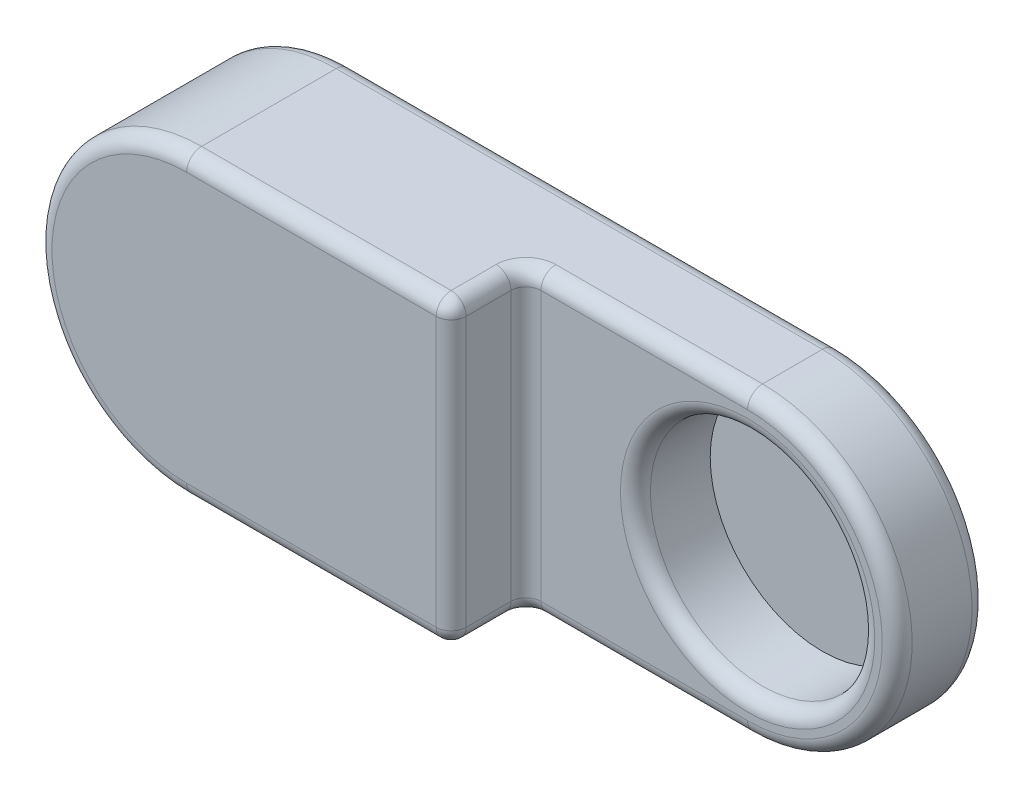
ISO-10303-21;
HEADER;
FILE_DESCRIPTION(('STEP AP214'),'2;1');
FILE_NAME('part.step','',(''),(''),'','','');
FILE_SCHEMA(('AUTOMOTIVE_DESIGN { 1 0 10303 214 1 1 1 1 }'));
ENDSEC;
DATA;
#1=APPLICATION_CONTEXT('core data for automotive mechanical design processes');
#2=APPLICATION_PROTOCOL_DEFINITION('international standard','automotive_design',2000,#1);
#3=PRODUCT_CONTEXT('',#1,'mechanical');
#4=PRODUCT('Part','Part','',(#3));
#5=PRODUCT_RELATED_PRODUCT_CATEGORY('part','',(#4));
#6=PRODUCT_DEFINITION_FORMATION('','',#4);
#7=PRODUCT_DEFINITION_CONTEXT('part definition',#1,'design');
#8=PRODUCT_DEFINITION('design','',#6,#7);
#9=PRODUCT_DEFINITION_SHAPE('','',#8);
#10=(LENGTH_UNIT() NAMED_UNIT(*) SI_UNIT(.MILLI.,.METRE.));
#11=(NAMED_UNIT(*) PLANE_ANGLE_UNIT() SI_UNIT($,.RADIAN.));
#12=(NAMED_UNIT(*) SI_UNIT($,.STERADIAN.) SOLID_ANGLE_UNIT());
#13=UNCERTAINTY_MEASURE_WITH_UNIT(LENGTH_MEASURE(1.E-05),#10,'distance_accuracy_value','');
#14=(GEOMETRIC_REPRESENTATION_CONTEXT(3) GLOBAL_UNCERTAINTY_ASSIGNED_CONTEXT((#13)) GLOBAL_UNIT_ASSIGNED_CONTEXT((#10,
#11,#12)) REPRESENTATION_CONTEXT('',''));
#15=CARTESIAN_POINT('',(0.,0.,0.));
#16=DIRECTION('',(0.,0.,1.));
#17=DIRECTION('',(1.,0.,0.));
#18=AXIS2_PLACEMENT_3D('',#15,#16,#17);
#19=CARTESIAN_POINT('',(324.922829987217,0.0333579448705819,10.));
#20=DIRECTION('',(0.,0.,-1.));
#21=DIRECTION('',(-1.,0.,0.));
#22=AXIS2_PLACEMENT_3D('',#19,#20,#21);
#23=CYLINDRICAL_SURFACE('',#22,74.9159288196887);
#24=CARTESIAN_POINT('',(324.922829987217,0.0333579448705819,10.));
#25=DIRECTION('',(0.,0.,-1.));
#26=DIRECTION('',(-1.,0.,0.));
#27=AXIS2_PLACEMENT_3D('',#24,#25,#26);
#28=CIRCLE('',#27,74.9159288196887);
#29=CARTESIAN_POINT('',(250.006901167528,0.0333579448705819,10.));
#30=VERTEX_POINT('',#29);
#31=EDGE_CURVE('E11',#30,#30,#28,.T.);
#32=ORIENTED_EDGE('',*,*,#31,.T.);
#33=EDGE_LOOP('',(#32));
#34=FACE_BOUND('',#33,.T.);
#35=CARTESIAN_POINT('',(324.922829987217,0.0333579448705819,0.));
#36=DIRECTION('',(0.,0.,-1.));
#37=DIRECTION('',(-1.,0.,0.));
#38=AXIS2_PLACEMENT_3D('',#35,#36,#37);
#39=CIRCLE('',#38,74.9159288196887);
#40=CARTESIAN_POINT('',(250.006901167528,0.0333579448705819,0.));
#41=VERTEX_POINT('',#40);
#42=EDGE_CURVE('E55',#41,#41,#39,.T.);
#43=ORIENTED_EDGE('',*,*,#42,.F.);
#44=EDGE_LOOP('',(#43));
#45=FACE_BOUND('',#44,.T.);
#46=ADVANCED_FACE('F52',(#34,#45),#23,.T.);
#47=CARTESIAN_POINT('',(324.922829987217,0.0333579448705819,10.));
#48=DIRECTION('',(0.,0.,-1.));
#49=DIRECTION('',(-1.,0.,0.));
#50=AXIS2_PLACEMENT_3D('',#47,#48,#49);
#51=PLANE('',#50);
#52=ORIENTED_EDGE('',*,*,#31,.F.);
#53=EDGE_LOOP('',(#52));
#54=FACE_BOUND('',#53,.T.);
#55=ADVANCED_FACE('F67',(#54),#51,.F.);
#56=CARTESIAN_POINT('',(324.922829987217,0.0333579448705819,0.));
#57=DIRECTION('',(0.,0.,-1.));
#58=DIRECTION('',(-1.,0.,0.));
#59=AXIS2_PLACEMENT_3D('',#56,#57,#58);
#60=PLANE('',#59);
#61=ORIENTED_EDGE('',*,*,#42,.T.);
#62=EDGE_LOOP('',(#61));
#63=FACE_BOUND('',#62,.T.);
#64=ADVANCED_FACE('F64',(#63),#60,.T.);
#65=CLOSED_SHELL('',(#46,#55,#64));
#66=MANIFOLD_SOLID_BREP('B2',#65);
#67=CARTESIAN_POINT('',(325.,0.,60.));
#68=DIRECTION('',(0.,0.,1.));
#69=DIRECTION('',(1.,0.,0.));
#70=AXIS2_PLACEMENT_3D('',#67,#68,#69);
#71=PLANE('',#70);
#72=CARTESIAN_POINT('',(325.,0.,60.));
#73=DIRECTION('',(0.,0.,1.));
#74=DIRECTION('',(1.,0.,0.));
#75=AXIS2_PLACEMENT_3D('',#72,#73,#74);
#76=CIRCLE('',#75,85.);
#77=CARTESIAN_POINT('',(410.,0.,60.));
#78=VERTEX_POINT('',#77);
#79=EDGE_CURVE('E102',#78,#78,#76,.F.);
#80=ORIENTED_EDGE('',*,*,#79,.T.);
#81=EDGE_LOOP('',(#80));
#82=FACE_BOUND('',#81,.T.);
#83=CARTESIAN_POINT('',(325.,0.,60.));
#84=DIRECTION('',(0.,0.,1.));
#85=DIRECTION('',(1.,0.,0.));
#86=AXIS2_PLACEMENT_3D('',#83,#84,#85);
#87=CIRCLE('',#86,90.);
#88=CARTESIAN_POINT('',(325.,-90.,60.));
#89=VERTEX_POINT('',#88);
#90=CARTESIAN_POINT('',(325.,90.,60.));
#91=VERTEX_POINT('',#90);
#92=EDGE_CURVE('E110',#89,#91,#87,.T.);
#93=ORIENTED_EDGE('',*,*,#92,.T.);
#94=DIRECTION('',(-1.,0.,0.));
#95=VECTOR('',#94,1.);
#96=CARTESIAN_POINT('',(176.83096553836,90.,60.));
#97=LINE('',#96,#95);
#98=CARTESIAN_POINT('',(186.83096553836,90.,60.));
#99=VERTEX_POINT('',#98);
#100=EDGE_CURVE('E329',#91,#99,#97,.T.);
#101=ORIENTED_EDGE('',*,*,#100,.T.);
#102=DIRECTION('',(0.,1.,0.));
#103=VECTOR('',#102,1.);
#104=CARTESIAN_POINT('',(186.83096553836,0.,60.));
#105=LINE('',#104,#103);
#106=CARTESIAN_POINT('',(186.83096553836,-90.,60.));
#107=VERTEX_POINT('',#106);
#108=EDGE_CURVE('E322',#99,#107,#105,.F.);
#109=ORIENTED_EDGE('',*,*,#108,.T.);
#110=DIRECTION('',(1.,0.,0.));
#111=VECTOR('',#110,1.);
#112=CARTESIAN_POINT('',(325.,-90.,60.));
#113=LINE('',#112,#111);
#114=EDGE_CURVE('E115',#107,#89,#113,.T.);
#115=ORIENTED_EDGE('',*,*,#114,.T.);
#116=EDGE_LOOP('',(#93,#101,#109,#115));
#117=FACE_BOUND('',#116,.T.);
#118=ADVANCED_FACE('F92',(#82,#117),#71,.T.);
#119=CARTESIAN_POINT('',(325.,0.,0.));
#120=DIRECTION('',(0.,0.,1.));
#121=DIRECTION('',(1.,0.,0.));
#122=AXIS2_PLACEMENT_3D('',#119,#120,#121);
#123=PLANE('',#122);
#124=CARTESIAN_POINT('',(0.,0.,0.));
#125=DIRECTION('',(0.,0.,1.));
#126=DIRECTION('',(1.,0.,0.));
#127=AXIS2_PLACEMENT_3D('',#124,#125,#126);
#128=CIRCLE('',#127,85.);
#129=CARTESIAN_POINT('',(85.,0.,0.));
#130=VERTEX_POINT('',#129);
#131=EDGE_CURVE('E216',#130,#130,#128,.T.);
#132=ORIENTED_EDGE('',*,*,#131,.T.);
#133=EDGE_LOOP('',(#132));
#134=FACE_BOUND('',#133,.T.);
#135=DIRECTION('',(-1.,0.,0.));
#136=VECTOR('',#135,1.);
#137=CARTESIAN_POINT('',(325.,90.,0.));
#138=LINE('',#137,#136);
#139=CARTESIAN_POINT('',(0.,90.,0.));
#140=VERTEX_POINT('',#139);
#141=CARTESIAN_POINT('',(325.,90.,0.));
#142=VERTEX_POINT('',#141);
#143=EDGE_CURVE('E289',#140,#142,#138,.F.);
#144=ORIENTED_EDGE('',*,*,#143,.T.);
#145=CARTESIAN_POINT('',(325.,0.,0.));
#146=DIRECTION('',(0.,0.,1.));
#147=DIRECTION('',(1.,0.,0.));
#148=AXIS2_PLACEMENT_3D('',#145,#146,#147);
#149=CIRCLE('',#148,90.);
#150=CARTESIAN_POINT('',(325.,-90.,0.));
#151=VERTEX_POINT('',#150);
#152=EDGE_CURVE('E298',#142,#151,#149,.F.);
#153=ORIENTED_EDGE('',*,*,#152,.T.);
#154=DIRECTION('',(1.,0.,0.));
#155=VECTOR('',#154,1.);
#156=CARTESIAN_POINT('',(325.,-90.,0.));
#157=LINE('',#156,#155);
#158=CARTESIAN_POINT('',(0.,-90.,0.));
#159=VERTEX_POINT('',#158);
#160=EDGE_CURVE('E295',#151,#159,#157,.F.);
#161=ORIENTED_EDGE('',*,*,#160,.T.);
#162=CARTESIAN_POINT('',(0.,0.,0.));
#163=DIRECTION('',(0.,0.,1.));
#164=DIRECTION('',(1.,0.,0.));
#165=AXIS2_PLACEMENT_3D('',#162,#163,#164);
#166=CIRCLE('',#165,90.);
#167=EDGE_CURVE('E292',#159,#140,#166,.F.);
#168=ORIENTED_EDGE('',*,*,#167,.T.);
#169=EDGE_LOOP('',(#144,#153,#161,#168));
#170=FACE_BOUND('',#169,.T.);
#171=CARTESIAN_POINT('',(325.,0.,0.));
#172=DIRECTION('',(0.,0.,1.));
#173=DIRECTION('',(1.,0.,0.));
#174=AXIS2_PLACEMENT_3D('',#171,#172,#173);
#175=CIRCLE('',#174,75.);
#176=CARTESIAN_POINT('',(400.,0.,0.));
#177=VERTEX_POINT('',#176);
#178=EDGE_CURVE('E465',#177,#177,#175,.T.);
#179=ORIENTED_EDGE('',*,*,#178,.T.);
#180=EDGE_LOOP('',(#179));
#181=FACE_BOUND('',#180,.T.);
#182=ADVANCED_FACE('F411',(#134,#170,#181),#123,.F.);
#183=CARTESIAN_POINT('',(325.,0.,60.));
#184=DIRECTION('',(0.,0.,-1.));
#185=DIRECTION('',(-1.,0.,0.));
#186=AXIS2_PLACEMENT_3D('',#183,#184,#185);
#187=CYLINDRICAL_SURFACE('',#186,100.);
#188=DIRECTION('',(0.,0.,-1.));
#189=VECTOR('',#188,1.);
#190=CARTESIAN_POINT('',(325.,-100.,60.));
#191=LINE('',#190,#189);
#192=CARTESIAN_POINT('',(325.,-100.,50.));
#193=VERTEX_POINT('',#192);
#194=CARTESIAN_POINT('',(325.,-100.,10.));
#195=VERTEX_POINT('',#194);
#196=EDGE_CURVE('E428',#193,#195,#191,.T.);
#197=ORIENTED_EDGE('',*,*,#196,.T.);
#198=CARTESIAN_POINT('',(325.,0.,10.));
#199=DIRECTION('',(0.,0.,1.));
#200=DIRECTION('',(1.,0.,0.));
#201=AXIS2_PLACEMENT_3D('',#198,#199,#200);
#202=CIRCLE('',#201,100.);
#203=CARTESIAN_POINT('',(325.,100.,10.));
#204=VERTEX_POINT('',#203);
#205=EDGE_CURVE('E285',#195,#204,#202,.T.);
#206=ORIENTED_EDGE('',*,*,#205,.T.);
#207=DIRECTION('',(0.,0.,-1.));
#208=VECTOR('',#207,1.);
#209=CARTESIAN_POINT('',(325.,100.,60.));
#210=LINE('',#209,#208);
#211=CARTESIAN_POINT('',(325.,100.,50.));
#212=VERTEX_POINT('',#211);
#213=EDGE_CURVE('E228',#212,#204,#210,.T.);
#214=ORIENTED_EDGE('',*,*,#213,.F.);
#215=CARTESIAN_POINT('',(325.,0.,50.));
#216=DIRECTION('',(0.,0.,1.));
#217=DIRECTION('',(1.,0.,0.));
#218=AXIS2_PLACEMENT_3D('',#215,#216,#217);
#219=CIRCLE('',#218,100.);
#220=EDGE_CURVE('E282',#212,#193,#219,.F.);
#221=ORIENTED_EDGE('',*,*,#220,.T.);
#222=EDGE_LOOP('',(#197,#206,#214,#221));
#223=FACE_BOUND('',#222,.T.);
#224=ADVANCED_FACE('F425',(#223),#187,.T.);
#225=CARTESIAN_POINT('',(0.,100.,60.));
#226=DIRECTION('',(0.,-1.,0.));
#227=DIRECTION('',(0.,0.,-1.));
#228=AXIS2_PLACEMENT_3D('',#225,#226,#227);
#229=PLANE('',#228);
#230=DIRECTION('',(0.,0.,-1.));
#231=VECTOR('',#230,1.);
#232=CARTESIAN_POINT('',(0.,100.,60.));
#233=LINE('',#232,#231);
#234=CARTESIAN_POINT('',(0.,100.,100.));
#235=VERTEX_POINT('',#234);
#236=CARTESIAN_POINT('',(0.,100.,10.));
#237=VERTEX_POINT('',#236);
#238=EDGE_CURVE('E206',#235,#237,#233,.T.);
#239=ORIENTED_EDGE('',*,*,#238,.F.);
#240=DIRECTION('',(-1.,0.,0.));
#241=VECTOR('',#240,1.);
#242=CARTESIAN_POINT('',(176.83096553836,100.,100.));
#243=LINE('',#242,#241);
#244=CARTESIAN_POINT('',(166.83096553836,100.,100.));
#245=VERTEX_POINT('',#244);
#246=EDGE_CURVE('E222',#235,#245,#243,.F.);
#247=ORIENTED_EDGE('',*,*,#246,.T.);
#248=DIRECTION('',(0.,0.,-1.));
#249=VECTOR('',#248,1.);
#250=CARTESIAN_POINT('',(166.83096553836,100.,60.));
#251=LINE('',#250,#249);
#252=CARTESIAN_POINT('',(166.83096553836,100.,70.));
#253=VERTEX_POINT('',#252);
#254=EDGE_CURVE('E247',#245,#253,#251,.T.);
#255=ORIENTED_EDGE('',*,*,#254,.T.);
#256=CARTESIAN_POINT('',(186.83096553836,100.,70.));
#257=DIRECTION('',(0.,-1.,0.));
#258=DIRECTION('',(0.,0.,-1.));
#259=AXIS2_PLACEMENT_3D('',#256,#257,#258);
#260=CIRCLE('',#259,20.);
#261=CARTESIAN_POINT('',(186.83096553836,100.,50.));
#262=VERTEX_POINT('',#261);
#263=EDGE_CURVE('E253',#262,#253,#260,.F.);
#264=ORIENTED_EDGE('',*,*,#263,.F.);
#265=DIRECTION('',(-1.,0.,0.));
#266=VECTOR('',#265,1.);
#267=CARTESIAN_POINT('',(325.,100.,50.));
#268=LINE('',#267,#266);
#269=EDGE_CURVE('E420',#262,#212,#268,.F.);
#270=ORIENTED_EDGE('',*,*,#269,.T.);
#271=ORIENTED_EDGE('',*,*,#213,.T.);
#272=DIRECTION('',(-1.,0.,0.));
#273=VECTOR('',#272,1.);
#274=CARTESIAN_POINT('',(0.,100.,10.));
#275=LINE('',#274,#273);
#276=EDGE_CURVE('E226',#204,#237,#275,.T.);
#277=ORIENTED_EDGE('',*,*,#276,.T.);
#278=EDGE_LOOP('',(#239,#247,#255,#264,#270,#271,#277));
#279=FACE_BOUND('',#278,.T.);
#280=ADVANCED_FACE('F219',(#279),#229,.F.);
#281=CARTESIAN_POINT('',(0.,0.,60.));
#282=DIRECTION('',(0.,0.,-1.));
#283=DIRECTION('',(-1.,0.,0.));
#284=AXIS2_PLACEMENT_3D('',#281,#282,#283);
#285=CYLINDRICAL_SURFACE('',#284,100.);
#286=ORIENTED_EDGE('',*,*,#238,.T.);
#287=CARTESIAN_POINT('',(0.,0.,10.));
#288=DIRECTION('',(0.,0.,1.));
#289=DIRECTION('',(1.,0.,0.));
#290=AXIS2_PLACEMENT_3D('',#287,#288,#289);
#291=CIRCLE('',#290,100.);
#292=CARTESIAN_POINT('',(0.,-100.,10.));
#293=VERTEX_POINT('',#292);
#294=EDGE_CURVE('E215',#237,#293,#291,.T.);
#295=ORIENTED_EDGE('',*,*,#294,.T.);
#296=DIRECTION('',(0.,0.,-1.));
#297=VECTOR('',#296,1.);
#298=CARTESIAN_POINT('',(0.,-100.,60.));
#299=LINE('',#298,#297);
#300=CARTESIAN_POINT('',(0.,-100.,100.));
#301=VERTEX_POINT('',#300);
#302=EDGE_CURVE('E209',#301,#293,#299,.T.);
#303=ORIENTED_EDGE('',*,*,#302,.F.);
#304=CARTESIAN_POINT('',(0.,0.,100.));
#305=DIRECTION('',(0.,0.,1.));
#306=DIRECTION('',(1.,0.,0.));
#307=AXIS2_PLACEMENT_3D('',#304,#305,#306);
#308=CIRCLE('',#307,100.);
#309=EDGE_CURVE('E203',#301,#235,#308,.F.);
#310=ORIENTED_EDGE('',*,*,#309,.T.);
#311=EDGE_LOOP('',(#286,#295,#303,#310));
#312=FACE_BOUND('',#311,.T.);
#313=ADVANCED_FACE('F205',(#312),#285,.T.);
#314=CARTESIAN_POINT('',(0.,-100.,60.));
#315=DIRECTION('',(0.,1.,0.));
#316=DIRECTION('',(0.,0.,1.));
#317=AXIS2_PLACEMENT_3D('',#314,#315,#316);
#318=PLANE('',#317);
#319=ORIENTED_EDGE('',*,*,#302,.T.);
#320=DIRECTION('',(1.,0.,0.));
#321=VECTOR('',#320,1.);
#322=CARTESIAN_POINT('',(0.,-100.,10.));
#323=LINE('',#322,#321);
#324=EDGE_CURVE('E279',#293,#195,#323,.T.);
#325=ORIENTED_EDGE('',*,*,#324,.T.);
#326=ORIENTED_EDGE('',*,*,#196,.F.);
#327=DIRECTION('',(1.,0.,0.));
#328=VECTOR('',#327,1.);
#329=CARTESIAN_POINT('',(176.83096553836,-100.,50.));
#330=LINE('',#329,#328);
#331=CARTESIAN_POINT('',(186.83096553836,-100.,50.));
#332=VERTEX_POINT('',#331);
#333=EDGE_CURVE('E270',#193,#332,#330,.F.);
#334=ORIENTED_EDGE('',*,*,#333,.T.);
#335=CARTESIAN_POINT('',(186.83096553836,-100.,70.));
#336=DIRECTION('',(0.,1.,0.));
#337=DIRECTION('',(0.,0.,1.));
#338=AXIS2_PLACEMENT_3D('',#335,#336,#337);
#339=CIRCLE('',#338,20.);
#340=CARTESIAN_POINT('',(166.83096553836,-100.,70.));
#341=VERTEX_POINT('',#340);
#342=EDGE_CURVE('E266',#341,#332,#339,.F.);
#343=ORIENTED_EDGE('',*,*,#342,.F.);
#344=DIRECTION('',(0.,0.,-1.));
#345=VECTOR('',#344,1.);
#346=CARTESIAN_POINT('',(166.83096553836,-100.,60.));
#347=LINE('',#346,#345);
#348=CARTESIAN_POINT('',(166.83096553836,-100.,100.));
#349=VERTEX_POINT('',#348);
#350=EDGE_CURVE('E273',#341,#349,#347,.F.);
#351=ORIENTED_EDGE('',*,*,#350,.T.);
#352=DIRECTION('',(1.,0.,0.));
#353=VECTOR('',#352,1.);
#354=CARTESIAN_POINT('',(0.,-100.,100.));
#355=LINE('',#354,#353);
#356=EDGE_CURVE('E276',#349,#301,#355,.F.);
#357=ORIENTED_EDGE('',*,*,#356,.T.);
#358=EDGE_LOOP('',(#319,#325,#326,#334,#343,#351,#357));
#359=FACE_BOUND('',#358,.T.);
#360=ADVANCED_FACE('F462',(#359),#318,.F.);
#361=CARTESIAN_POINT('',(0.,0.,60.));
#362=DIRECTION('',(0.,0.,-1.));
#363=DIRECTION('',(-1.,0.,0.));
#364=AXIS2_PLACEMENT_3D('',#361,#362,#363);
#365=CYLINDRICAL_SURFACE('',#364,75.);
#366=CARTESIAN_POINT('',(0.,0.,10.));
#367=DIRECTION('',(0.,0.,1.));
#368=DIRECTION('',(1.,0.,0.));
#369=AXIS2_PLACEMENT_3D('',#366,#367,#368);
#370=CIRCLE('',#369,75.);
#371=CARTESIAN_POINT('',(75.,0.,10.));
#372=VERTEX_POINT('',#371);
#373=EDGE_CURVE('E50',#372,#372,#370,.F.);
#374=ORIENTED_EDGE('',*,*,#373,.T.);
#375=EDGE_LOOP('',(#374));
#376=FACE_BOUND('',#375,.T.);
#377=CARTESIAN_POINT('',(0.,0.,60.));
#378=DIRECTION('',(0.,0.,1.));
#379=DIRECTION('',(1.,0.,0.));
#380=AXIS2_PLACEMENT_3D('',#377,#378,#379);
#381=CIRCLE('',#380,75.);
#382=CARTESIAN_POINT('',(75.,0.,60.));
#383=VERTEX_POINT('',#382);
#384=EDGE_CURVE('E387',#383,#383,#381,.T.);
#385=ORIENTED_EDGE('',*,*,#384,.T.);
#386=EDGE_LOOP('',(#385));
#387=FACE_BOUND('',#386,.T.);
#388=ADVANCED_FACE('F497',(#376,#387),#365,.F.);
#389=CARTESIAN_POINT('',(325.,0.,60.));
#390=DIRECTION('',(0.,0.,-1.));
#391=DIRECTION('',(-1.,0.,0.));
#392=AXIS2_PLACEMENT_3D('',#389,#390,#391);
#393=CYLINDRICAL_SURFACE('',#392,75.);
#394=CARTESIAN_POINT('',(325.,0.,50.));
#395=DIRECTION('',(0.,0.,1.));
#396=DIRECTION('',(1.,0.,0.));
#397=AXIS2_PLACEMENT_3D('',#394,#395,#396);
#398=CIRCLE('',#397,75.);
#399=CARTESIAN_POINT('',(400.,0.,50.));
#400=VERTEX_POINT('',#399);
#401=EDGE_CURVE('E318',#400,#400,#398,.T.);
#402=ORIENTED_EDGE('',*,*,#401,.T.);
#403=EDGE_LOOP('',(#402));
#404=FACE_BOUND('',#403,.T.);
#405=ORIENTED_EDGE('',*,*,#178,.F.);
#406=EDGE_LOOP('',(#405));
#407=FACE_BOUND('',#406,.T.);
#408=ADVANCED_FACE('F494',(#404,#407),#393,.F.);
#409=CARTESIAN_POINT('',(0.,0.,110.));
#410=DIRECTION('',(0.,0.,1.));
#411=DIRECTION('',(1.,0.,0.));
#412=AXIS2_PLACEMENT_3D('',#409,#410,#411);
#413=PLANE('',#412);
#414=DIRECTION('',(1.,0.,0.));
#415=VECTOR('',#414,1.);
#416=CARTESIAN_POINT('',(176.83096553836,-90.,110.));
#417=LINE('',#416,#415);
#418=CARTESIAN_POINT('',(0.,-90.,110.));
#419=VERTEX_POINT('',#418);
#420=CARTESIAN_POINT('',(166.83096553836,-90.,110.));
#421=VERTEX_POINT('',#420);
#422=EDGE_CURVE('E309',#419,#421,#417,.T.);
#423=ORIENTED_EDGE('',*,*,#422,.T.);
#424=DIRECTION('',(0.,1.,0.));
#425=VECTOR('',#424,1.);
#426=CARTESIAN_POINT('',(166.83096553836,100.,110.));
#427=LINE('',#426,#425);
#428=CARTESIAN_POINT('',(166.83096553836,90.,110.));
#429=VERTEX_POINT('',#428);
#430=EDGE_CURVE('E315',#421,#429,#427,.T.);
#431=ORIENTED_EDGE('',*,*,#430,.T.);
#432=DIRECTION('',(-1.,0.,0.));
#433=VECTOR('',#432,1.);
#434=CARTESIAN_POINT('',(0.,90.,110.));
#435=LINE('',#434,#433);
#436=CARTESIAN_POINT('',(0.,90.,110.));
#437=VERTEX_POINT('',#436);
#438=EDGE_CURVE('E312',#429,#437,#435,.T.);
#439=ORIENTED_EDGE('',*,*,#438,.T.);
#440=CARTESIAN_POINT('',(0.,0.,110.));
#441=DIRECTION('',(0.,0.,1.));
#442=DIRECTION('',(1.,0.,0.));
#443=AXIS2_PLACEMENT_3D('',#440,#441,#442);
#444=CIRCLE('',#443,90.);
#445=EDGE_CURVE('E233',#437,#419,#444,.T.);
#446=ORIENTED_EDGE('',*,*,#445,.T.);
#447=EDGE_LOOP('',(#423,#431,#439,#446));
#448=FACE_BOUND('',#447,.T.);
#449=ADVANCED_FACE('F496',(#448),#413,.T.);
#450=CARTESIAN_POINT('',(176.83096553836,100.,110.));
#451=DIRECTION('',(-1.,0.,0.));
#452=DIRECTION('',(0.,-1.,0.));
#453=AXIS2_PLACEMENT_3D('',#450,#451,#452);
#454=PLANE('',#453);
#455=DIRECTION('',(0.,0.,-1.));
#456=VECTOR('',#455,1.);
#457=CARTESIAN_POINT('',(176.83096553836,-90.,110.));
#458=LINE('',#457,#456);
#459=CARTESIAN_POINT('',(176.83096553836,-90.,100.));
#460=VERTEX_POINT('',#459);
#461=CARTESIAN_POINT('',(176.83096553836,-90.,70.));
#462=VERTEX_POINT('',#461);
#463=EDGE_CURVE('E251',#460,#462,#458,.T.);
#464=ORIENTED_EDGE('',*,*,#463,.T.);
#465=DIRECTION('',(0.,1.,0.));
#466=VECTOR('',#465,1.);
#467=CARTESIAN_POINT('',(176.83096553836,100.,70.));
#468=LINE('',#467,#466);
#469=CARTESIAN_POINT('',(176.83096553836,90.,70.));
#470=VERTEX_POINT('',#469);
#471=EDGE_CURVE('E263',#462,#470,#468,.T.);
#472=ORIENTED_EDGE('',*,*,#471,.T.);
#473=DIRECTION('',(0.,0.,-1.));
#474=VECTOR('',#473,1.);
#475=CARTESIAN_POINT('',(176.83096553836,90.,110.));
#476=LINE('',#475,#474);
#477=CARTESIAN_POINT('',(176.83096553836,90.,100.));
#478=VERTEX_POINT('',#477);
#479=EDGE_CURVE('E259',#470,#478,#476,.F.);
#480=ORIENTED_EDGE('',*,*,#479,.T.);
#481=DIRECTION('',(0.,1.,0.));
#482=VECTOR('',#481,1.);
#483=CARTESIAN_POINT('',(176.83096553836,-100.,100.));
#484=LINE('',#483,#482);
#485=EDGE_CURVE('E246',#478,#460,#484,.F.);
#486=ORIENTED_EDGE('',*,*,#485,.T.);
#487=EDGE_LOOP('',(#464,#472,#480,#486));
#488=FACE_BOUND('',#487,.T.);
#489=ADVANCED_FACE('F446',(#488),#454,.F.);
#490=CARTESIAN_POINT('',(0.,0.,60.));
#491=DIRECTION('',(0.,0.,1.));
#492=DIRECTION('',(1.,0.,0.));
#493=AXIS2_PLACEMENT_3D('',#490,#491,#492);
#494=PLANE('',#493);
#495=ORIENTED_EDGE('',*,*,#384,.F.);
#496=EDGE_LOOP('',(#495));
#497=FACE_BOUND('',#496,.T.);
#498=ADVANCED_FACE('F559',(#497),#494,.F.);
#499=CARTESIAN_POINT('',(0.,-90.,100.));
#500=DIRECTION('',(-1.,0.,0.));
#501=DIRECTION('',(0.,0.,1.));
#502=AXIS2_PLACEMENT_3D('',#499,#500,#501);
#503=CYLINDRICAL_SURFACE('',#502,10.);
#504=CARTESIAN_POINT('',(0.,-90.,100.));
#505=DIRECTION('',(-1.,0.,0.));
#506=DIRECTION('',(0.,0.,1.));
#507=AXIS2_PLACEMENT_3D('',#504,#505,#506);
#508=CIRCLE('',#507,10.);
#509=EDGE_CURVE('E376',#301,#419,#508,.T.);
#510=ORIENTED_EDGE('',*,*,#509,.F.);
#511=ORIENTED_EDGE('',*,*,#356,.F.);
#512=CARTESIAN_POINT('',(166.83096553836,-90.,100.));
#513=DIRECTION('',(1.,0.,0.));
#514=DIRECTION('',(0.,0.,-1.));
#515=AXIS2_PLACEMENT_3D('',#512,#513,#514);
#516=CIRCLE('',#515,10.);
#517=EDGE_CURVE('E379',#421,#349,#516,.T.);
#518=ORIENTED_EDGE('',*,*,#517,.F.);
#519=ORIENTED_EDGE('',*,*,#422,.F.);
#520=EDGE_LOOP('',(#510,#511,#518,#519));
#521=FACE_BOUND('',#520,.T.);
#522=ADVANCED_FACE('F484',(#521),#503,.T.);
#523=CARTESIAN_POINT('',(325.,-90.,50.));
#524=DIRECTION('',(-1.,0.,0.));
#525=DIRECTION('',(0.,0.,1.));
#526=AXIS2_PLACEMENT_3D('',#523,#524,#525);
#527=CYLINDRICAL_SURFACE('',#526,10.);
#528=CARTESIAN_POINT('',(186.83096553836,-90.,50.));
#529=DIRECTION('',(-1.,0.,0.));
#530=DIRECTION('',(0.,0.,1.));
#531=AXIS2_PLACEMENT_3D('',#528,#529,#530);
#532=CIRCLE('',#531,10.);
#533=EDGE_CURVE('E368',#332,#107,#532,.T.);
#534=ORIENTED_EDGE('',*,*,#533,.F.);
#535=ORIENTED_EDGE('',*,*,#333,.F.);
#536=CARTESIAN_POINT('',(325.,-90.,50.));
#537=DIRECTION('',(1.,0.,0.));
#538=DIRECTION('',(0.,0.,-1.));
#539=AXIS2_PLACEMENT_3D('',#536,#537,#538);
#540=CIRCLE('',#539,10.);
#541=EDGE_CURVE('E372',#89,#193,#540,.T.);
#542=ORIENTED_EDGE('',*,*,#541,.F.);
#543=ORIENTED_EDGE('',*,*,#114,.F.);
#544=EDGE_LOOP('',(#534,#535,#542,#543));
#545=FACE_BOUND('',#544,.T.);
#546=ADVANCED_FACE('F468',(#545),#527,.T.);
#547=CARTESIAN_POINT('',(166.83096553836,-90.,110.));
#548=DIRECTION('',(0.,0.,-1.));
#549=DIRECTION('',(-1.,0.,0.));
#550=AXIS2_PLACEMENT_3D('',#547,#548,#549);
#551=CYLINDRICAL_SURFACE('',#550,10.);
#552=CARTESIAN_POINT('',(166.83096553836,-90.,100.));
#553=DIRECTION('',(0.,0.,1.));
#554=DIRECTION('',(1.,0.,0.));
#555=AXIS2_PLACEMENT_3D('',#552,#553,#554);
#556=CIRCLE('',#555,10.);
#557=EDGE_CURVE('E383',#349,#460,#556,.T.);
#558=ORIENTED_EDGE('',*,*,#557,.F.);
#559=ORIENTED_EDGE('',*,*,#350,.F.);
#560=CARTESIAN_POINT('',(166.83096553836,-90.,70.));
#561=DIRECTION('',(0.,0.,-1.));
#562=DIRECTION('',(-1.,0.,0.));
#563=AXIS2_PLACEMENT_3D('',#560,#561,#562);
#564=CIRCLE('',#563,10.);
#565=EDGE_CURVE('E364',#462,#341,#564,.T.);
#566=ORIENTED_EDGE('',*,*,#565,.F.);
#567=ORIENTED_EDGE('',*,*,#463,.F.);
#568=EDGE_LOOP('',(#558,#559,#566,#567));
#569=FACE_BOUND('',#568,.T.);
#570=ADVANCED_FACE('F476',(#569),#551,.T.);
#571=CARTESIAN_POINT('',(166.83096553836,-90.,100.));
#572=DIRECTION('',(0.,-1.,0.));
#573=DIRECTION('',(0.,0.,-1.));
#574=AXIS2_PLACEMENT_3D('',#571,#572,#573);
#575=SPHERICAL_SURFACE('',#574,10.);
#576=ORIENTED_EDGE('',*,*,#517,.T.);
#577=ORIENTED_EDGE('',*,*,#557,.T.);
#578=CARTESIAN_POINT('',(166.83096553836,-90.,100.));
#579=DIRECTION('',(0.,-1.,0.));
#580=DIRECTION('',(0.,0.,-1.));
#581=AXIS2_PLACEMENT_3D('',#578,#579,#580);
#582=CIRCLE('',#581,10.);
#583=EDGE_CURVE('E238',#421,#460,#582,.F.);
#584=ORIENTED_EDGE('',*,*,#583,.F.);
#585=EDGE_LOOP('',(#576,#577,#584));
#586=FACE_BOUND('',#585,.T.);
#587=ADVANCED_FACE('F480',(#586),#575,.T.);
#588=CARTESIAN_POINT('',(0.,0.,100.));
#589=DIRECTION('',(0.,0.,1.));
#590=DIRECTION('',(1.,0.,0.));
#591=AXIS2_PLACEMENT_3D('',#588,#589,#590);
#592=TOROIDAL_SURFACE('',#591,90.,10.);
#593=ORIENTED_EDGE('',*,*,#509,.T.);
#594=ORIENTED_EDGE('',*,*,#445,.F.);
#595=CARTESIAN_POINT('',(0.,90.,100.));
#596=DIRECTION('',(1.,0.,0.));
#597=DIRECTION('',(0.,0.,-1.));
#598=AXIS2_PLACEMENT_3D('',#595,#596,#597);
#599=CIRCLE('',#598,10.);
#600=EDGE_CURVE('E231',#235,#437,#599,.T.);
#601=ORIENTED_EDGE('',*,*,#600,.F.);
#602=ORIENTED_EDGE('',*,*,#309,.F.);
#603=EDGE_LOOP('',(#593,#594,#601,#602));
#604=FACE_BOUND('',#603,.T.);
#605=ADVANCED_FACE('F232',(#604),#592,.T.);
#606=CARTESIAN_POINT('',(325.,0.,50.));
#607=DIRECTION('',(0.,0.,1.));
#608=DIRECTION('',(1.,0.,0.));
#609=AXIS2_PLACEMENT_3D('',#606,#607,#608);
#610=TOROIDAL_SURFACE('',#609,90.,10.);
#611=ORIENTED_EDGE('',*,*,#541,.T.);
#612=ORIENTED_EDGE('',*,*,#220,.F.);
#613=CARTESIAN_POINT('',(325.,90.,50.));
#614=DIRECTION('',(-1.,0.,0.));
#615=DIRECTION('',(0.,0.,1.));
#616=AXIS2_PLACEMENT_3D('',#613,#614,#615);
#617=CIRCLE('',#616,10.);
#618=EDGE_CURVE('E239',#91,#212,#617,.T.);
#619=ORIENTED_EDGE('',*,*,#618,.F.);
#620=ORIENTED_EDGE('',*,*,#92,.F.);
#621=EDGE_LOOP('',(#611,#612,#619,#620));
#622=FACE_BOUND('',#621,.T.);
#623=ADVANCED_FACE('F459',(#622),#610,.T.);
#624=CARTESIAN_POINT('',(186.83096553836,-90.,70.));
#625=DIRECTION('',(0.,1.,0.));
#626=DIRECTION('',(0.,0.,1.));
#627=AXIS2_PLACEMENT_3D('',#624,#625,#626);
#628=TOROIDAL_SURFACE('',#627,20.,10.);
#629=ORIENTED_EDGE('',*,*,#342,.T.);
#630=ORIENTED_EDGE('',*,*,#533,.T.);
#631=CARTESIAN_POINT('',(186.83096553836,-90.,70.));
#632=DIRECTION('',(0.,1.,0.));
#633=DIRECTION('',(0.,0.,1.));
#634=AXIS2_PLACEMENT_3D('',#631,#632,#633);
#635=CIRCLE('',#634,10.);
#636=EDGE_CURVE('E354',#462,#107,#635,.F.);
#637=ORIENTED_EDGE('',*,*,#636,.F.);
#638=ORIENTED_EDGE('',*,*,#565,.T.);
#639=EDGE_LOOP('',(#629,#630,#637,#638));
#640=FACE_BOUND('',#639,.T.);
#641=ADVANCED_FACE('F471',(#640),#628,.T.);
#642=CARTESIAN_POINT('',(166.83096553836,0.,100.));
#643=DIRECTION('',(0.,-1.,0.));
#644=DIRECTION('',(1.,0.,0.));
#645=AXIS2_PLACEMENT_3D('',#642,#643,#644);
#646=CYLINDRICAL_SURFACE('',#645,10.);
#647=ORIENTED_EDGE('',*,*,#583,.T.);
#648=ORIENTED_EDGE('',*,*,#485,.F.);
#649=CARTESIAN_POINT('',(166.83096553836,90.,100.));
#650=DIRECTION('',(0.,1.,0.));
#651=DIRECTION('',(0.,0.,1.));
#652=AXIS2_PLACEMENT_3D('',#649,#650,#651);
#653=CIRCLE('',#652,10.);
#654=EDGE_CURVE('E350',#429,#478,#653,.T.);
#655=ORIENTED_EDGE('',*,*,#654,.F.);
#656=ORIENTED_EDGE('',*,*,#430,.F.);
#657=EDGE_LOOP('',(#647,#648,#655,#656));
#658=FACE_BOUND('',#657,.T.);
#659=ADVANCED_FACE('F541',(#658),#646,.T.);
#660=CARTESIAN_POINT('',(0.,90.,100.));
#661=DIRECTION('',(1.,0.,0.));
#662=DIRECTION('',(0.,0.,-1.));
#663=AXIS2_PLACEMENT_3D('',#660,#661,#662);
#664=CYLINDRICAL_SURFACE('',#663,10.);
#665=ORIENTED_EDGE('',*,*,#600,.T.);
#666=ORIENTED_EDGE('',*,*,#438,.F.);
#667=CARTESIAN_POINT('',(166.83096553836,90.,100.));
#668=DIRECTION('',(1.,0.,0.));
#669=DIRECTION('',(0.,0.,-1.));
#670=AXIS2_PLACEMENT_3D('',#667,#668,#669);
#671=CIRCLE('',#670,10.);
#672=EDGE_CURVE('E243',#245,#429,#671,.T.);
#673=ORIENTED_EDGE('',*,*,#672,.F.);
#674=ORIENTED_EDGE('',*,*,#246,.F.);
#675=EDGE_LOOP('',(#665,#666,#673,#674));
#676=FACE_BOUND('',#675,.T.);
#677=ADVANCED_FACE('F241',(#676),#664,.T.);
#678=CARTESIAN_POINT('',(325.,90.,50.));
#679=DIRECTION('',(1.,0.,0.));
#680=DIRECTION('',(0.,0.,-1.));
#681=AXIS2_PLACEMENT_3D('',#678,#679,#680);
#682=CYLINDRICAL_SURFACE('',#681,10.);
#683=ORIENTED_EDGE('',*,*,#618,.T.);
#684=ORIENTED_EDGE('',*,*,#269,.F.);
#685=CARTESIAN_POINT('',(186.83096553836,90.,50.));
#686=DIRECTION('',(-1.,0.,0.));
#687=DIRECTION('',(0.,0.,1.));
#688=AXIS2_PLACEMENT_3D('',#685,#686,#687);
#689=CIRCLE('',#688,10.);
#690=EDGE_CURVE('E344',#99,#262,#689,.T.);
#691=ORIENTED_EDGE('',*,*,#690,.F.);
#692=ORIENTED_EDGE('',*,*,#100,.F.);
#693=EDGE_LOOP('',(#683,#684,#691,#692));
#694=FACE_BOUND('',#693,.T.);
#695=ADVANCED_FACE('F457',(#694),#682,.T.);
#696=CARTESIAN_POINT('',(186.83096553836,100.,70.));
#697=DIRECTION('',(0.,1.,0.));
#698=DIRECTION('',(-1.,0.,0.));
#699=AXIS2_PLACEMENT_3D('',#696,#697,#698);
#700=CYLINDRICAL_SURFACE('',#699,10.);
#701=ORIENTED_EDGE('',*,*,#636,.T.);
#702=ORIENTED_EDGE('',*,*,#108,.F.);
#703=CARTESIAN_POINT('',(186.83096553836,90.,70.));
#704=DIRECTION('',(0.,-1.,0.));
#705=DIRECTION('',(0.,0.,-1.));
#706=AXIS2_PLACEMENT_3D('',#703,#704,#705);
#707=CIRCLE('',#706,10.);
#708=EDGE_CURVE('E341',#470,#99,#707,.T.);
#709=ORIENTED_EDGE('',*,*,#708,.F.);
#710=ORIENTED_EDGE('',*,*,#471,.F.);
#711=EDGE_LOOP('',(#701,#702,#709,#710));
#712=FACE_BOUND('',#711,.T.);
#713=ADVANCED_FACE('F454',(#712),#700,.F.);
#714=CARTESIAN_POINT('',(166.83096553836,90.,100.));
#715=DIRECTION('',(0.,0.,1.));
#716=DIRECTION('',(1.,0.,0.));
#717=AXIS2_PLACEMENT_3D('',#714,#715,#716);
#718=SPHERICAL_SURFACE('',#717,10.);
#719=ORIENTED_EDGE('',*,*,#672,.T.);
#720=ORIENTED_EDGE('',*,*,#654,.T.);
#721=CARTESIAN_POINT('',(166.83096553836,90.,100.));
#722=DIRECTION('',(0.,0.,1.));
#723=DIRECTION('',(1.,0.,0.));
#724=AXIS2_PLACEMENT_3D('',#721,#722,#723);
#725=CIRCLE('',#724,10.);
#726=EDGE_CURVE('E338',#245,#478,#725,.F.);
#727=ORIENTED_EDGE('',*,*,#726,.F.);
#728=EDGE_LOOP('',(#719,#720,#727));
#729=FACE_BOUND('',#728,.T.);
#730=ADVANCED_FACE('F531',(#729),#718,.T.);
#731=CARTESIAN_POINT('',(186.83096553836,90.,70.));
#732=DIRECTION('',(0.,-1.,0.));
#733=DIRECTION('',(0.,0.,-1.));
#734=AXIS2_PLACEMENT_3D('',#731,#732,#733);
#735=TOROIDAL_SURFACE('',#734,20.,10.);
#736=ORIENTED_EDGE('',*,*,#690,.T.);
#737=ORIENTED_EDGE('',*,*,#263,.T.);
#738=CARTESIAN_POINT('',(166.83096553836,90.,70.));
#739=DIRECTION('',(0.,0.,-1.));
#740=DIRECTION('',(-1.,0.,0.));
#741=AXIS2_PLACEMENT_3D('',#738,#739,#740);
#742=CIRCLE('',#741,10.);
#743=EDGE_CURVE('E335',#470,#253,#742,.F.);
#744=ORIENTED_EDGE('',*,*,#743,.F.);
#745=ORIENTED_EDGE('',*,*,#708,.T.);
#746=EDGE_LOOP('',(#736,#737,#744,#745));
#747=FACE_BOUND('',#746,.T.);
#748=ADVANCED_FACE('F439',(#747),#735,.T.);
#749=CARTESIAN_POINT('',(166.83096553836,90.,60.));
#750=DIRECTION('',(0.,0.,-1.));
#751=DIRECTION('',(-1.,0.,0.));
#752=AXIS2_PLACEMENT_3D('',#749,#750,#751);
#753=CYLINDRICAL_SURFACE('',#752,10.);
#754=ORIENTED_EDGE('',*,*,#726,.T.);
#755=ORIENTED_EDGE('',*,*,#479,.F.);
#756=ORIENTED_EDGE('',*,*,#743,.T.);
#757=ORIENTED_EDGE('',*,*,#254,.F.);
#758=EDGE_LOOP('',(#754,#755,#756,#757));
#759=FACE_BOUND('',#758,.T.);
#760=ADVANCED_FACE('F443',(#759),#753,.T.);
#761=CARTESIAN_POINT('',(0.,0.,10.));
#762=DIRECTION('',(0.,0.,1.));
#763=DIRECTION('',(1.,0.,0.));
#764=AXIS2_PLACEMENT_3D('',#761,#762,#763);
#765=TOROIDAL_SURFACE('',#764,90.,10.);
#766=CARTESIAN_POINT('',(0.,90.,10.));
#767=DIRECTION('',(1.,0.,0.));
#768=DIRECTION('',(0.,0.,-1.));
#769=AXIS2_PLACEMENT_3D('',#766,#767,#768);
#770=CIRCLE('',#769,10.);
#771=EDGE_CURVE('E393',#140,#237,#770,.T.);
#772=ORIENTED_EDGE('',*,*,#771,.F.);
#773=ORIENTED_EDGE('',*,*,#167,.F.);
#774=CARTESIAN_POINT('',(0.,-90.,10.));
#775=DIRECTION('',(1.,0.,0.));
#776=DIRECTION('',(0.,1.,0.));
#777=AXIS2_PLACEMENT_3D('',#774,#775,#776);
#778=CIRCLE('',#777,10.);
#779=EDGE_CURVE('E96',#293,#159,#778,.T.);
#780=ORIENTED_EDGE('',*,*,#779,.F.);
#781=ORIENTED_EDGE('',*,*,#294,.F.);
#782=EDGE_LOOP('',(#772,#773,#780,#781));
#783=FACE_BOUND('',#782,.T.);
#784=ADVANCED_FACE('F409',(#783),#765,.T.);
#785=CARTESIAN_POINT('',(0.,-90.,10.));
#786=DIRECTION('',(1.,0.,0.));
#787=DIRECTION('',(0.,0.,-1.));
#788=AXIS2_PLACEMENT_3D('',#785,#786,#787);
#789=CYLINDRICAL_SURFACE('',#788,10.);
#790=ORIENTED_EDGE('',*,*,#779,.T.);
#791=ORIENTED_EDGE('',*,*,#160,.F.);
#792=CARTESIAN_POINT('',(325.,-90.,10.));
#793=DIRECTION('',(1.,0.,0.));
#794=DIRECTION('',(0.,0.,-1.));
#795=AXIS2_PLACEMENT_3D('',#792,#793,#794);
#796=CIRCLE('',#795,10.);
#797=EDGE_CURVE('E391',#195,#151,#796,.T.);
#798=ORIENTED_EDGE('',*,*,#797,.F.);
#799=ORIENTED_EDGE('',*,*,#324,.F.);
#800=EDGE_LOOP('',(#790,#791,#798,#799));
#801=FACE_BOUND('',#800,.T.);
#802=ADVANCED_FACE('F405',(#801),#789,.T.);
#803=CARTESIAN_POINT('',(0.,90.,10.));
#804=DIRECTION('',(-1.,0.,0.));
#805=DIRECTION('',(0.,0.,1.));
#806=AXIS2_PLACEMENT_3D('',#803,#804,#805);
#807=CYLINDRICAL_SURFACE('',#806,10.);
#808=ORIENTED_EDGE('',*,*,#771,.T.);
#809=ORIENTED_EDGE('',*,*,#276,.F.);
#810=CARTESIAN_POINT('',(325.,90.,10.));
#811=DIRECTION('',(1.,0.,0.));
#812=DIRECTION('',(0.,0.,-1.));
#813=AXIS2_PLACEMENT_3D('',#810,#811,#812);
#814=CIRCLE('',#813,10.);
#815=EDGE_CURVE('E388',#142,#204,#814,.T.);
#816=ORIENTED_EDGE('',*,*,#815,.F.);
#817=ORIENTED_EDGE('',*,*,#143,.F.);
#818=EDGE_LOOP('',(#808,#809,#816,#817));
#819=FACE_BOUND('',#818,.T.);
#820=ADVANCED_FACE('F418',(#819),#807,.T.);
#821=CARTESIAN_POINT('',(325.,0.,10.));
#822=DIRECTION('',(0.,0.,1.));
#823=DIRECTION('',(1.,0.,0.));
#824=AXIS2_PLACEMENT_3D('',#821,#822,#823);
#825=TOROIDAL_SURFACE('',#824,90.,10.);
#826=ORIENTED_EDGE('',*,*,#797,.T.);
#827=ORIENTED_EDGE('',*,*,#152,.F.);
#828=ORIENTED_EDGE('',*,*,#815,.T.);
#829=ORIENTED_EDGE('',*,*,#205,.F.);
#830=EDGE_LOOP('',(#826,#827,#828,#829));
#831=FACE_BOUND('',#830,.T.);
#832=ADVANCED_FACE('F416',(#831),#825,.T.);
#833=CARTESIAN_POINT('',(325.,0.,50.));
#834=DIRECTION('',(0.,0.,1.));
#835=DIRECTION('',(1.,0.,0.));
#836=AXIS2_PLACEMENT_3D('',#833,#834,#835);
#837=TOROIDAL_SURFACE('',#836,85.,10.);
#838=ORIENTED_EDGE('',*,*,#79,.F.);
#839=EDGE_LOOP('',(#838));
#840=FACE_BOUND('',#839,.T.);
#841=ORIENTED_EDGE('',*,*,#401,.F.);
#842=EDGE_LOOP('',(#841));
#843=FACE_BOUND('',#842,.T.);
#844=ADVANCED_FACE('F562',(#840,#843),#837,.T.);
#845=CARTESIAN_POINT('',(0.,0.,10.));
#846=DIRECTION('',(0.,0.,1.));
#847=DIRECTION('',(1.,0.,0.));
#848=AXIS2_PLACEMENT_3D('',#845,#846,#847);
#849=TOROIDAL_SURFACE('',#848,85.,10.);
#850=ORIENTED_EDGE('',*,*,#373,.F.);
#851=EDGE_LOOP('',(#850));
#852=FACE_BOUND('',#851,.T.);
#853=ORIENTED_EDGE('',*,*,#131,.F.);
#854=EDGE_LOOP('',(#853));
#855=FACE_BOUND('',#854,.T.);
#856=ADVANCED_FACE('F94',(#852,#855),#849,.T.);
#857=CLOSED_SHELL('',(#118,#182,#224,#280,#313,#360,#388,#408,#449,#489,#498,#522,#546,#570,
#587,#605,#623,#641,#659,#677,#695,#713,#730,#748,#760,#784,#802,#820,#832,#844,#856));
#858=MANIFOLD_SOLID_BREP('B6',#857);
#859=ADVANCED_BREP_SHAPE_REPRESENTATION('',(#18,#66,#858),#14);
#860=SHAPE_DEFINITION_REPRESENTATION(#9,#859);
ENDSEC;
END-ISO-10303-21;
